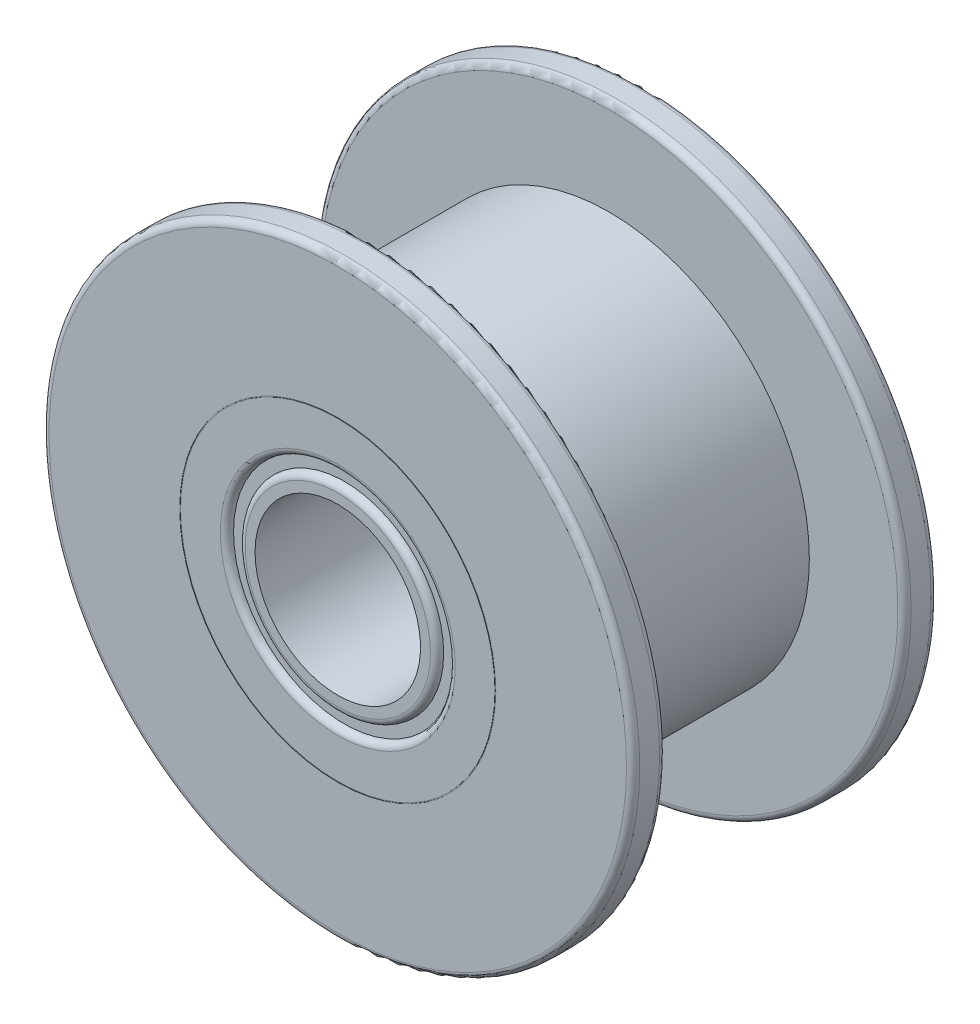
ISO-10303-21;
HEADER;
FILE_DESCRIPTION(('STEP AP214'),'2;1');
FILE_NAME('part.step','',(''),(''),'','','');
FILE_SCHEMA(('AUTOMOTIVE_DESIGN { 1 0 10303 214 1 1 1 1 }'));
ENDSEC;
DATA;
#1=APPLICATION_CONTEXT('core data for automotive mechanical design processes');
#2=APPLICATION_PROTOCOL_DEFINITION('international standard','automotive_design',2000,#1);
#3=PRODUCT_CONTEXT('',#1,'mechanical');
#4=PRODUCT('Part','Part','',(#3));
#5=PRODUCT_RELATED_PRODUCT_CATEGORY('part','',(#4));
#6=PRODUCT_DEFINITION_FORMATION('','',#4);
#7=PRODUCT_DEFINITION_CONTEXT('part definition',#1,'design');
#8=PRODUCT_DEFINITION('design','',#6,#7);
#9=PRODUCT_DEFINITION_SHAPE('','',#8);
#10=(LENGTH_UNIT() NAMED_UNIT(*) SI_UNIT(.MILLI.,.METRE.));
#11=(NAMED_UNIT(*) PLANE_ANGLE_UNIT() SI_UNIT($,.RADIAN.));
#12=(NAMED_UNIT(*) SI_UNIT($,.STERADIAN.) SOLID_ANGLE_UNIT());
#13=UNCERTAINTY_MEASURE_WITH_UNIT(LENGTH_MEASURE(1.E-05),#10,'distance_accuracy_value','');
#14=(GEOMETRIC_REPRESENTATION_CONTEXT(3) GLOBAL_UNCERTAINTY_ASSIGNED_CONTEXT((#13)) GLOBAL_UNIT_ASSIGNED_CONTEXT((#10,
#11,#12)) REPRESENTATION_CONTEXT('',''));
#15=CARTESIAN_POINT('',(0.,0.,0.));
#16=DIRECTION('',(0.,0.,1.));
#17=DIRECTION('',(1.,0.,0.));
#18=AXIS2_PLACEMENT_3D('',#15,#16,#17);
#19=CARTESIAN_POINT('',(0.,0.,-1.));
#20=DIRECTION('',(0.,0.,-1.));
#21=DIRECTION('',(-1.,0.,0.));
#22=AXIS2_PLACEMENT_3D('',#19,#20,#21);
#23=PLANE('',#22);
#24=CARTESIAN_POINT('',(0.,0.,-1.));
#25=DIRECTION('',(0.,0.,-1.));
#26=DIRECTION('',(-1.,0.,0.));
#27=AXIS2_PLACEMENT_3D('',#24,#25,#26);
#28=CIRCLE('',#27,2.8);
#29=CARTESIAN_POINT('',(-2.8,0.,-1.));
#30=VERTEX_POINT('',#29);
#31=EDGE_CURVE('E80',#30,#30,#28,.T.);
#32=ORIENTED_EDGE('',*,*,#31,.T.);
#33=EDGE_LOOP('',(#32));
#34=FACE_BOUND('',#33,.T.);
#35=CARTESIAN_POINT('',(0.,0.,-1.));
#36=DIRECTION('',(0.,0.,-1.));
#37=DIRECTION('',(-1.,0.,0.));
#38=AXIS2_PLACEMENT_3D('',#35,#36,#37);
#39=CIRCLE('',#38,2.5);
#40=CARTESIAN_POINT('',(-2.5,0.,-1.));
#41=VERTEX_POINT('',#40);
#42=EDGE_CURVE('E84',#41,#41,#39,.T.);
#43=ORIENTED_EDGE('',*,*,#42,.F.);
#44=EDGE_LOOP('',(#43));
#45=FACE_BOUND('',#44,.T.);
#46=ADVANCED_FACE('F39',(#34,#45),#23,.T.);
#47=CARTESIAN_POINT('',(0.,0.,8.2));
#48=DIRECTION('',(0.,0.,1.));
#49=DIRECTION('',(1.,0.,0.));
#50=AXIS2_PLACEMENT_3D('',#47,#48,#49);
#51=PLANE('',#50);
#52=CARTESIAN_POINT('',(0.,0.,8.2));
#53=DIRECTION('',(0.,0.,1.));
#54=DIRECTION('',(1.,0.,0.));
#55=AXIS2_PLACEMENT_3D('',#52,#53,#54);
#56=CIRCLE('',#55,2.8);
#57=CARTESIAN_POINT('',(2.8,0.,8.2));
#58=VERTEX_POINT('',#57);
#59=EDGE_CURVE('E74',#58,#58,#56,.T.);
#60=ORIENTED_EDGE('',*,*,#59,.T.);
#61=EDGE_LOOP('',(#60));
#62=FACE_BOUND('',#61,.T.);
#63=CARTESIAN_POINT('',(0.,0.,8.2));
#64=DIRECTION('',(0.,0.,-1.));
#65=DIRECTION('',(-1.,0.,0.));
#66=AXIS2_PLACEMENT_3D('',#63,#64,#65);
#67=CIRCLE('',#66,2.5);
#68=CARTESIAN_POINT('',(-2.5,0.,8.2));
#69=VERTEX_POINT('',#68);
#70=EDGE_CURVE('E83',#69,#69,#67,.T.);
#71=ORIENTED_EDGE('',*,*,#70,.T.);
#72=EDGE_LOOP('',(#71));
#73=FACE_BOUND('',#72,.T.);
#74=ADVANCED_FACE('F153',(#62,#73),#51,.T.);
#75=CARTESIAN_POINT('',(0.,0.,-1.));
#76=DIRECTION('',(0.,0.,-1.));
#77=DIRECTION('',(-1.,0.,0.));
#78=AXIS2_PLACEMENT_3D('',#75,#76,#77);
#79=CIRCLE('',#78,3.55);
#80=CARTESIAN_POINT('',(-3.55,0.,-1.));
#81=VERTEX_POINT('',#80);
#82=EDGE_CURVE('E77',#81,#81,#79,.F.);
#83=ORIENTED_EDGE('',*,*,#82,.T.);
#84=EDGE_LOOP('',(#83));
#85=FACE_BOUND('',#84,.T.);
#86=CARTESIAN_POINT('',(0.,0.,-1.));
#87=DIRECTION('',(0.,0.,-1.));
#88=DIRECTION('',(-1.,0.,0.));
#89=AXIS2_PLACEMENT_3D('',#86,#87,#88);
#90=CIRCLE('',#89,4.75);
#91=CARTESIAN_POINT('',(-4.75,0.,-1.));
#92=VERTEX_POINT('',#91);
#93=EDGE_CURVE('E108',#92,#92,#90,.T.);
#94=ORIENTED_EDGE('',*,*,#93,.T.);
#95=EDGE_LOOP('',(#94));
#96=FACE_BOUND('',#95,.T.);
#97=ADVANCED_FACE('F159',(#85,#96),#23,.T.);
#98=CARTESIAN_POINT('',(0.,0.,8.2));
#99=DIRECTION('',(0.,0.,1.));
#100=DIRECTION('',(1.,0.,0.));
#101=AXIS2_PLACEMENT_3D('',#98,#99,#100);
#102=CIRCLE('',#101,3.55);
#103=CARTESIAN_POINT('',(3.55,0.,8.2));
#104=VERTEX_POINT('',#103);
#105=EDGE_CURVE('E71',#104,#104,#102,.F.);
#106=ORIENTED_EDGE('',*,*,#105,.T.);
#107=EDGE_LOOP('',(#106));
#108=FACE_BOUND('',#107,.T.);
#109=CARTESIAN_POINT('',(0.,0.,8.2));
#110=DIRECTION('',(0.,0.,1.));
#111=DIRECTION('',(1.,0.,0.));
#112=AXIS2_PLACEMENT_3D('',#109,#110,#111);
#113=CIRCLE('',#112,4.75);
#114=CARTESIAN_POINT('',(4.75,0.,8.2));
#115=VERTEX_POINT('',#114);
#116=EDGE_CURVE('E96',#115,#115,#113,.T.);
#117=ORIENTED_EDGE('',*,*,#116,.T.);
#118=EDGE_LOOP('',(#117));
#119=FACE_BOUND('',#118,.T.);
#120=ADVANCED_FACE('F154',(#108,#119),#51,.T.);
#121=CARTESIAN_POINT('',(0.,0.,8.2));
#122=DIRECTION('',(0.,0.,-1.));
#123=DIRECTION('',(-1.,0.,0.));
#124=AXIS2_PLACEMENT_3D('',#121,#122,#123);
#125=CYLINDRICAL_SURFACE('',#124,8.925);
#126=CARTESIAN_POINT('',(0.,0.,8.));
#127=DIRECTION('',(0.,0.,1.));
#128=DIRECTION('',(1.,0.,0.));
#129=AXIS2_PLACEMENT_3D('',#126,#127,#128);
#130=CIRCLE('',#129,8.925);
#131=CARTESIAN_POINT('',(8.925,0.,8.));
#132=VERTEX_POINT('',#131);
#133=EDGE_CURVE('E62',#132,#132,#130,.F.);
#134=ORIENTED_EDGE('',*,*,#133,.T.);
#135=EDGE_LOOP('',(#134));
#136=FACE_BOUND('',#135,.T.);
#137=CARTESIAN_POINT('',(0.,0.,7.4));
#138=DIRECTION('',(0.,0.,1.));
#139=DIRECTION('',(1.,0.,0.));
#140=AXIS2_PLACEMENT_3D('',#137,#138,#139);
#141=CIRCLE('',#140,8.925);
#142=CARTESIAN_POINT('',(8.925,0.,7.4));
#143=VERTEX_POINT('',#142);
#144=EDGE_CURVE('E65',#143,#143,#141,.T.);
#145=ORIENTED_EDGE('',*,*,#144,.T.);
#146=EDGE_LOOP('',(#145));
#147=FACE_BOUND('',#146,.T.);
#148=ADVANCED_FACE('F150',(#136,#147),#125,.T.);
#149=CARTESIAN_POINT('',(0.,0.,8.2));
#150=DIRECTION('',(0.,0.,1.));
#151=DIRECTION('',(1.,0.,0.));
#152=AXIS2_PLACEMENT_3D('',#149,#150,#151);
#153=CIRCLE('',#152,8.725);
#154=CARTESIAN_POINT('',(8.725,0.,8.2));
#155=VERTEX_POINT('',#154);
#156=EDGE_CURVE('E68',#155,#155,#153,.T.);
#157=ORIENTED_EDGE('',*,*,#156,.T.);
#158=EDGE_LOOP('',(#157));
#159=FACE_BOUND('',#158,.T.);
#160=CARTESIAN_POINT('',(0.,0.,8.2));
#161=DIRECTION('',(0.,0.,1.));
#162=DIRECTION('',(1.,0.,0.));
#163=AXIS2_PLACEMENT_3D('',#160,#161,#162);
#164=CIRCLE('',#163,4.775);
#165=CARTESIAN_POINT('',(4.775,0.,8.2));
#166=VERTEX_POINT('',#165);
#167=EDGE_CURVE('E90',#166,#166,#164,.T.);
#168=ORIENTED_EDGE('',*,*,#167,.F.);
#169=EDGE_LOOP('',(#168));
#170=FACE_BOUND('',#169,.T.);
#171=ADVANCED_FACE('F138',(#159,#170),#51,.T.);
#172=CARTESIAN_POINT('',(0.,0.,7.2));
#173=DIRECTION('',(0.,0.,1.));
#174=DIRECTION('',(1.,0.,0.));
#175=AXIS2_PLACEMENT_3D('',#172,#173,#174);
#176=PLANE('',#175);
#177=CARTESIAN_POINT('',(0.,0.,7.2));
#178=DIRECTION('',(0.,0.,1.));
#179=DIRECTION('',(1.,0.,0.));
#180=AXIS2_PLACEMENT_3D('',#177,#178,#179);
#181=CIRCLE('',#180,8.725);
#182=CARTESIAN_POINT('',(8.725,0.,7.2));
#183=VERTEX_POINT('',#182);
#184=EDGE_CURVE('E59',#183,#183,#181,.F.);
#185=ORIENTED_EDGE('',*,*,#184,.T.);
#186=EDGE_LOOP('',(#185));
#187=FACE_BOUND('',#186,.T.);
#188=CARTESIAN_POINT('',(0.,0.,7.2));
#189=DIRECTION('',(0.,0.,-1.));
#190=DIRECTION('',(-1.,0.,0.));
#191=AXIS2_PLACEMENT_3D('',#188,#189,#190);
#192=CIRCLE('',#191,6.05);
#193=CARTESIAN_POINT('',(-6.05,0.,7.2));
#194=VERTEX_POINT('',#193);
#195=EDGE_CURVE('E125',#194,#194,#192,.T.);
#196=ORIENTED_EDGE('',*,*,#195,.F.);
#197=EDGE_LOOP('',(#196));
#198=FACE_BOUND('',#197,.T.);
#199=ADVANCED_FACE('F135',(#187,#198),#176,.F.);
#200=CARTESIAN_POINT('',(0.,0.,-1.));
#201=DIRECTION('',(0.,0.,1.));
#202=DIRECTION('',(1.,0.,0.));
#203=AXIS2_PLACEMENT_3D('',#200,#201,#202);
#204=CYLINDRICAL_SURFACE('',#203,8.925);
#205=CARTESIAN_POINT('',(0.,0.,-0.2));
#206=DIRECTION('',(0.,0.,-1.));
#207=DIRECTION('',(-1.,0.,0.));
#208=AXIS2_PLACEMENT_3D('',#205,#206,#207);
#209=CIRCLE('',#208,8.925);
#210=CARTESIAN_POINT('',(-8.925,0.,-0.2));
#211=VERTEX_POINT('',#210);
#212=EDGE_CURVE('E50',#211,#211,#209,.T.);
#213=ORIENTED_EDGE('',*,*,#212,.T.);
#214=EDGE_LOOP('',(#213));
#215=FACE_BOUND('',#214,.T.);
#216=CARTESIAN_POINT('',(0.,0.,-0.8));
#217=DIRECTION('',(0.,0.,-1.));
#218=DIRECTION('',(-1.,0.,0.));
#219=AXIS2_PLACEMENT_3D('',#216,#217,#218);
#220=CIRCLE('',#219,8.925);
#221=CARTESIAN_POINT('',(-8.925,0.,-0.8));
#222=VERTEX_POINT('',#221);
#223=EDGE_CURVE('E54',#222,#222,#220,.F.);
#224=ORIENTED_EDGE('',*,*,#223,.T.);
#225=EDGE_LOOP('',(#224));
#226=FACE_BOUND('',#225,.T.);
#227=ADVANCED_FACE('F137',(#215,#226),#204,.T.);
#228=CARTESIAN_POINT('',(0.,0.,-1.));
#229=DIRECTION('',(0.,0.,-1.));
#230=DIRECTION('',(-1.,0.,0.));
#231=AXIS2_PLACEMENT_3D('',#228,#229,#230);
#232=CIRCLE('',#231,8.725);
#233=CARTESIAN_POINT('',(-8.725,0.,-1.));
#234=VERTEX_POINT('',#233);
#235=EDGE_CURVE('E11',#234,#234,#232,.T.);
#236=ORIENTED_EDGE('',*,*,#235,.T.);
#237=EDGE_LOOP('',(#236));
#238=FACE_BOUND('',#237,.T.);
#239=CARTESIAN_POINT('',(0.,0.,-1.));
#240=DIRECTION('',(0.,0.,-1.));
#241=DIRECTION('',(-1.,0.,0.));
#242=AXIS2_PLACEMENT_3D('',#239,#240,#241);
#243=CIRCLE('',#242,4.775);
#244=CARTESIAN_POINT('',(-4.775,0.,-1.));
#245=VERTEX_POINT('',#244);
#246=EDGE_CURVE('E102',#245,#245,#243,.T.);
#247=ORIENTED_EDGE('',*,*,#246,.F.);
#248=EDGE_LOOP('',(#247));
#249=FACE_BOUND('',#248,.T.);
#250=ADVANCED_FACE('F146',(#238,#249),#23,.T.);
#251=CARTESIAN_POINT('',(0.,0.,0.));
#252=DIRECTION('',(0.,0.,-1.));
#253=DIRECTION('',(-1.,0.,0.));
#254=AXIS2_PLACEMENT_3D('',#251,#252,#253);
#255=PLANE('',#254);
#256=CARTESIAN_POINT('',(0.,0.,0.));
#257=DIRECTION('',(0.,0.,-1.));
#258=DIRECTION('',(-1.,0.,0.));
#259=AXIS2_PLACEMENT_3D('',#256,#257,#258);
#260=CIRCLE('',#259,8.725);
#261=CARTESIAN_POINT('',(-8.725,0.,0.));
#262=VERTEX_POINT('',#261);
#263=EDGE_CURVE('E46',#262,#262,#260,.F.);
#264=ORIENTED_EDGE('',*,*,#263,.T.);
#265=EDGE_LOOP('',(#264));
#266=FACE_BOUND('',#265,.T.);
#267=CARTESIAN_POINT('',(0.,0.,0.));
#268=DIRECTION('',(0.,0.,-1.));
#269=DIRECTION('',(-1.,0.,0.));
#270=AXIS2_PLACEMENT_3D('',#267,#268,#269);
#271=CIRCLE('',#270,6.05);
#272=CARTESIAN_POINT('',(-6.05,0.,0.));
#273=VERTEX_POINT('',#272);
#274=EDGE_CURVE('E126',#273,#273,#271,.T.);
#275=ORIENTED_EDGE('',*,*,#274,.T.);
#276=EDGE_LOOP('',(#275));
#277=FACE_BOUND('',#276,.T.);
#278=ADVANCED_FACE('F170',(#266,#277),#255,.F.);
#279=CARTESIAN_POINT('',(0.,0.,8.2));
#280=DIRECTION('',(0.,0.,-1.));
#281=DIRECTION('',(-1.,0.,0.));
#282=AXIS2_PLACEMENT_3D('',#279,#280,#281);
#283=CYLINDRICAL_SURFACE('',#282,2.5);
#284=ORIENTED_EDGE('',*,*,#70,.F.);
#285=EDGE_LOOP('',(#284));
#286=FACE_BOUND('',#285,.T.);
#287=ORIENTED_EDGE('',*,*,#42,.T.);
#288=EDGE_LOOP('',(#287));
#289=FACE_BOUND('',#288,.T.);
#290=ADVANCED_FACE('F174',(#286,#289),#283,.F.);
#291=CARTESIAN_POINT('',(0.,0.,8.19));
#292=DIRECTION('',(0.,0.,1.));
#293=DIRECTION('',(1.,0.,0.));
#294=AXIS2_PLACEMENT_3D('',#291,#292,#293);
#295=CYLINDRICAL_SURFACE('',#294,4.775);
#296=CARTESIAN_POINT('',(0.,0.,8.19));
#297=DIRECTION('',(0.,0.,1.));
#298=DIRECTION('',(1.,0.,0.));
#299=AXIS2_PLACEMENT_3D('',#296,#297,#298);
#300=CIRCLE('',#299,4.775);
#301=CARTESIAN_POINT('',(4.775,0.,8.19));
#302=VERTEX_POINT('',#301);
#303=EDGE_CURVE('E87',#302,#302,#300,.T.);
#304=CARTESIAN_POINT('',(4.775,0.,8.19));
#305=CARTESIAN_POINT('',(4.775,0.,8.19010416666666));
#306=CARTESIAN_POINT('',(4.775,0.,8.19020833333333));
#307=CARTESIAN_POINT('',(4.775,0.,8.19041666666667));
#308=CARTESIAN_POINT('',(4.775,0.,8.19052083333333));
#309=CARTESIAN_POINT('',(4.775,0.,8.19072916666667));
#310=CARTESIAN_POINT('',(4.775,0.,8.19083333333333));
#311=CARTESIAN_POINT('',(4.775,0.,8.19104166666667));
#312=CARTESIAN_POINT('',(4.775,0.,8.19114583333333));
#313=CARTESIAN_POINT('',(4.775,0.,8.19135416666667));
#314=CARTESIAN_POINT('',(4.775,0.,8.19145833333333));
#315=CARTESIAN_POINT('',(4.775,0.,8.19166666666666));
#316=CARTESIAN_POINT('',(4.775,0.,8.19177083333333));
#317=CARTESIAN_POINT('',(4.775,0.,8.19197916666666));
#318=CARTESIAN_POINT('',(4.775,0.,8.19208333333333));
#319=CARTESIAN_POINT('',(4.775,0.,8.19229166666667));
#320=CARTESIAN_POINT('',(4.775,0.,8.19239583333333));
#321=CARTESIAN_POINT('',(4.775,0.,8.19260416666667));
#322=CARTESIAN_POINT('',(4.775,0.,8.19270833333333));
#323=CARTESIAN_POINT('',(4.775,0.,8.19291666666667));
#324=CARTESIAN_POINT('',(4.775,0.,8.19302083333333));
#325=CARTESIAN_POINT('',(4.775,0.,8.19322916666667));
#326=CARTESIAN_POINT('',(4.775,0.,8.19333333333333));
#327=CARTESIAN_POINT('',(4.775,0.,8.19354166666666));
#328=CARTESIAN_POINT('',(4.775,0.,8.19364583333333));
#329=CARTESIAN_POINT('',(4.775,0.,8.19385416666666));
#330=CARTESIAN_POINT('',(4.775,0.,8.19395833333333));
#331=CARTESIAN_POINT('',(4.775,0.,8.19416666666667));
#332=CARTESIAN_POINT('',(4.775,0.,8.19427083333333));
#333=CARTESIAN_POINT('',(4.775,0.,8.19447916666667));
#334=CARTESIAN_POINT('',(4.775,0.,8.19458333333333));
#335=CARTESIAN_POINT('',(4.775,0.,8.19479166666666));
#336=CARTESIAN_POINT('',(4.775,0.,8.19489583333333));
#337=CARTESIAN_POINT('',(4.775,0.,8.19510416666667));
#338=CARTESIAN_POINT('',(4.775,0.,8.19520833333333));
#339=CARTESIAN_POINT('',(4.775,0.,8.19541666666666));
#340=CARTESIAN_POINT('',(4.775,0.,8.19552083333333));
#341=CARTESIAN_POINT('',(4.775,0.,8.19572916666667));
#342=CARTESIAN_POINT('',(4.775,0.,8.19583333333333));
#343=CARTESIAN_POINT('',(4.775,0.,8.19604166666667));
#344=CARTESIAN_POINT('',(4.775,0.,8.19614583333333));
#345=CARTESIAN_POINT('',(4.775,0.,8.19635416666667));
#346=CARTESIAN_POINT('',(4.775,0.,8.19645833333333));
#347=CARTESIAN_POINT('',(4.775,0.,8.19666666666667));
#348=CARTESIAN_POINT('',(4.775,0.,8.19677083333333));
#349=CARTESIAN_POINT('',(4.775,0.,8.19697916666667));
#350=CARTESIAN_POINT('',(4.775,0.,8.19708333333333));
#351=CARTESIAN_POINT('',(4.775,0.,8.19729166666666));
#352=CARTESIAN_POINT('',(4.775,0.,8.19739583333333));
#353=CARTESIAN_POINT('',(4.775,0.,8.19760416666667));
#354=CARTESIAN_POINT('',(4.775,0.,8.19770833333333));
#355=CARTESIAN_POINT('',(4.775,0.,8.19791666666667));
#356=CARTESIAN_POINT('',(4.775,0.,8.19802083333333));
#357=CARTESIAN_POINT('',(4.775,0.,8.19822916666666));
#358=CARTESIAN_POINT('',(4.775,0.,8.19833333333333));
#359=CARTESIAN_POINT('',(4.775,0.,8.19854166666667));
#360=CARTESIAN_POINT('',(4.775,0.,8.19864583333333));
#361=CARTESIAN_POINT('',(4.775,0.,8.19885416666667));
#362=CARTESIAN_POINT('',(4.775,0.,8.19895833333333));
#363=CARTESIAN_POINT('',(4.775,0.,8.19916666666666));
#364=CARTESIAN_POINT('',(4.775,0.,8.19927083333333));
#365=CARTESIAN_POINT('',(4.775,0.,8.19947916666667));
#366=CARTESIAN_POINT('',(4.775,0.,8.19958333333333));
#367=CARTESIAN_POINT('',(4.775,0.,8.19979166666666));
#368=CARTESIAN_POINT('',(4.775,0.,8.19989583333333));
#369=CARTESIAN_POINT('',(4.775,0.,8.2));
#370=B_SPLINE_CURVE_WITH_KNOTS('',3,(#304,#305,#306,#307,#308,#309,#310,#311,#312,#313,#314,
#315,#316,#317,#318,#319,#320,#321,#322,#323,#324,#325,#326,#327,#328,#329,#330,#331,#332,#333,
#334,#335,#336,#337,#338,#339,#340,#341,#342,#343,#344,#345,#346,#347,#348,#349,#350,#351,#352,
#353,#354,#355,#356,#357,#358,#359,#360,#361,#362,#363,#364,#365,#366,#367,#368,#369),
.UNSPECIFIED.,.F.,.F.,(4,2,2,2,2,2,2,2,2,2,2,2,2,2,2,2,2,2,2,2,2,2,2,2,2,2,2,2,2,2,2,2,4),(0.,
0.000312500000000313,0.000625000000000625,0.000937500000000938,0.00125000000000125,
0.00156250000000156,0.00187500000000014,0.00218750000000045,0.00250000000000077,
0.00281250000000108,0.00312500000000139,0.00343749999999997,0.00375000000000028,
0.00406250000000059,0.00437500000000091,0.00468750000000122,0.0049999999999998,
0.00531250000000011,0.00562500000000042,0.00593750000000073,0.00625000000000105,
0.00656250000000136,0.00687499999999994,0.00718750000000025,0.00750000000000056,
0.00781250000000087,0.00812500000000119,0.00843749999999976,0.00875000000000008,
0.00906250000000039,0.0093750000000007,0.00968750000000101,0.00999999999999959),.UNSPECIFIED.);
#371=EDGE_CURVE('BSEAM199',#302,#166,#370,.T.);
#372=ORIENTED_EDGE('',*,*,#303,.F.);
#373=ORIENTED_EDGE('',*,*,#167,.T.);
#374=ORIENTED_EDGE('',*,*,#371,.T.);
#375=ORIENTED_EDGE('',*,*,#371,.F.);
#376=EDGE_LOOP('',(#372,#374,#373,#375));
#377=FACE_BOUND('',#376,.T.);
#378=ADVANCED_FACE('F199',(#377),#295,.F.);
#379=CARTESIAN_POINT('',(0.,0.,8.19));
#380=DIRECTION('',(0.,0.,1.));
#381=DIRECTION('',(1.,0.,0.));
#382=AXIS2_PLACEMENT_3D('',#379,#380,#381);
#383=PLANE('',#382);
#384=CARTESIAN_POINT('',(0.,0.,8.19));
#385=DIRECTION('',(0.,0.,1.));
#386=DIRECTION('',(1.,0.,0.));
#387=AXIS2_PLACEMENT_3D('',#384,#385,#386);
#388=CIRCLE('',#387,4.75);
#389=CARTESIAN_POINT('',(4.75,0.,8.19));
#390=VERTEX_POINT('',#389);
#391=EDGE_CURVE('E93',#390,#390,#388,.T.);
#392=ORIENTED_EDGE('',*,*,#391,.F.);
#393=EDGE_LOOP('',(#392));
#394=FACE_BOUND('',#393,.T.);
#395=ORIENTED_EDGE('',*,*,#303,.T.);
#396=EDGE_LOOP('',(#395));
#397=FACE_BOUND('',#396,.T.);
#398=ADVANCED_FACE('F191',(#394,#397),#383,.T.);
#399=CARTESIAN_POINT('',(0.,0.,8.19));
#400=DIRECTION('',(0.,0.,1.));
#401=DIRECTION('',(1.,0.,0.));
#402=AXIS2_PLACEMENT_3D('',#399,#400,#401);
#403=CYLINDRICAL_SURFACE('',#402,4.75);
#404=CARTESIAN_POINT('',(4.75,0.,8.19));
#405=CARTESIAN_POINT('',(4.75,0.,8.19010416666666));
#406=CARTESIAN_POINT('',(4.75,0.,8.19020833333333));
#407=CARTESIAN_POINT('',(4.75,0.,8.19041666666667));
#408=CARTESIAN_POINT('',(4.75,0.,8.19052083333333));
#409=CARTESIAN_POINT('',(4.75,0.,8.19072916666667));
#410=CARTESIAN_POINT('',(4.75,0.,8.19083333333333));
#411=CARTESIAN_POINT('',(4.75,0.,8.19104166666667));
#412=CARTESIAN_POINT('',(4.75,0.,8.19114583333333));
#413=CARTESIAN_POINT('',(4.75,0.,8.19135416666667));
#414=CARTESIAN_POINT('',(4.75,0.,8.19145833333333));
#415=CARTESIAN_POINT('',(4.75,0.,8.19166666666666));
#416=CARTESIAN_POINT('',(4.75,0.,8.19177083333333));
#417=CARTESIAN_POINT('',(4.75,0.,8.19197916666666));
#418=CARTESIAN_POINT('',(4.75,0.,8.19208333333333));
#419=CARTESIAN_POINT('',(4.75,0.,8.19229166666667));
#420=CARTESIAN_POINT('',(4.75,0.,8.19239583333333));
#421=CARTESIAN_POINT('',(4.75,0.,8.19260416666667));
#422=CARTESIAN_POINT('',(4.75,0.,8.19270833333333));
#423=CARTESIAN_POINT('',(4.75,0.,8.19291666666667));
#424=CARTESIAN_POINT('',(4.75,0.,8.19302083333333));
#425=CARTESIAN_POINT('',(4.75,0.,8.19322916666667));
#426=CARTESIAN_POINT('',(4.75,0.,8.19333333333333));
#427=CARTESIAN_POINT('',(4.75,0.,8.19354166666666));
#428=CARTESIAN_POINT('',(4.75,0.,8.19364583333333));
#429=CARTESIAN_POINT('',(4.75,0.,8.19385416666666));
#430=CARTESIAN_POINT('',(4.75,0.,8.19395833333333));
#431=CARTESIAN_POINT('',(4.75,0.,8.19416666666667));
#432=CARTESIAN_POINT('',(4.75,0.,8.19427083333333));
#433=CARTESIAN_POINT('',(4.75,0.,8.19447916666667));
#434=CARTESIAN_POINT('',(4.75,0.,8.19458333333333));
#435=CARTESIAN_POINT('',(4.75,0.,8.19479166666666));
#436=CARTESIAN_POINT('',(4.75,0.,8.19489583333333));
#437=CARTESIAN_POINT('',(4.75,0.,8.19510416666667));
#438=CARTESIAN_POINT('',(4.75,0.,8.19520833333333));
#439=CARTESIAN_POINT('',(4.75,0.,8.19541666666666));
#440=CARTESIAN_POINT('',(4.75,0.,8.19552083333333));
#441=CARTESIAN_POINT('',(4.75,0.,8.19572916666667));
#442=CARTESIAN_POINT('',(4.75,0.,8.19583333333333));
#443=CARTESIAN_POINT('',(4.75,0.,8.19604166666667));
#444=CARTESIAN_POINT('',(4.75,0.,8.19614583333333));
#445=CARTESIAN_POINT('',(4.75,0.,8.19635416666667));
#446=CARTESIAN_POINT('',(4.75,0.,8.19645833333333));
#447=CARTESIAN_POINT('',(4.75,0.,8.19666666666667));
#448=CARTESIAN_POINT('',(4.75,0.,8.19677083333333));
#449=CARTESIAN_POINT('',(4.75,0.,8.19697916666667));
#450=CARTESIAN_POINT('',(4.75,0.,8.19708333333333));
#451=CARTESIAN_POINT('',(4.75,0.,8.19729166666666));
#452=CARTESIAN_POINT('',(4.75,0.,8.19739583333333));
#453=CARTESIAN_POINT('',(4.75,0.,8.19760416666667));
#454=CARTESIAN_POINT('',(4.75,0.,8.19770833333333));
#455=CARTESIAN_POINT('',(4.75,0.,8.19791666666667));
#456=CARTESIAN_POINT('',(4.75,0.,8.19802083333333));
#457=CARTESIAN_POINT('',(4.75,0.,8.19822916666666));
#458=CARTESIAN_POINT('',(4.75,0.,8.19833333333333));
#459=CARTESIAN_POINT('',(4.75,0.,8.19854166666667));
#460=CARTESIAN_POINT('',(4.75,0.,8.19864583333333));
#461=CARTESIAN_POINT('',(4.75,0.,8.19885416666667));
#462=CARTESIAN_POINT('',(4.75,0.,8.19895833333333));
#463=CARTESIAN_POINT('',(4.75,0.,8.19916666666666));
#464=CARTESIAN_POINT('',(4.75,0.,8.19927083333333));
#465=CARTESIAN_POINT('',(4.75,0.,8.19947916666667));
#466=CARTESIAN_POINT('',(4.75,0.,8.19958333333333));
#467=CARTESIAN_POINT('',(4.75,0.,8.19979166666666));
#468=CARTESIAN_POINT('',(4.75,0.,8.19989583333333));
#469=CARTESIAN_POINT('',(4.75,0.,8.2));
#470=B_SPLINE_CURVE_WITH_KNOTS('',3,(#404,#405,#406,#407,#408,#409,#410,#411,#412,#413,#414,
#415,#416,#417,#418,#419,#420,#421,#422,#423,#424,#425,#426,#427,#428,#429,#430,#431,#432,#433,
#434,#435,#436,#437,#438,#439,#440,#441,#442,#443,#444,#445,#446,#447,#448,#449,#450,#451,#452,
#453,#454,#455,#456,#457,#458,#459,#460,#461,#462,#463,#464,#465,#466,#467,#468,#469),
.UNSPECIFIED.,.F.,.F.,(4,2,2,2,2,2,2,2,2,2,2,2,2,2,2,2,2,2,2,2,2,2,2,2,2,2,2,2,2,2,2,2,4),(0.,
0.000312499999998578,0.00062499999999889,0.000937499999999203,0.00124999999999952,
0.00156249999999983,0.00187499999999841,0.00218749999999872,0.00249999999999903,
0.00281249999999934,0.00312499999999966,0.00343749999999823,0.00374999999999855,
0.00406249999999886,0.00437499999999917,0.00468749999999948,0.00499999999999806,
0.00531249999999837,0.00562499999999869,0.005937499999999,0.00624999999999931,
0.00656249999999962,0.0068749999999982,0.00718749999999851,0.00749999999999883,
0.00781249999999914,0.00812499999999945,0.00843749999999803,0.00874999999999834,
0.00906249999999865,0.00937499999999897,0.00968749999999928,0.00999999999999786),.UNSPECIFIED.);
#471=EDGE_CURVE('BSEAM181',#390,#115,#470,.T.);
#472=ORIENTED_EDGE('',*,*,#391,.T.);
#473=ORIENTED_EDGE('',*,*,#116,.F.);
#474=ORIENTED_EDGE('',*,*,#471,.T.);
#475=ORIENTED_EDGE('',*,*,#471,.F.);
#476=EDGE_LOOP('',(#472,#474,#473,#475));
#477=FACE_BOUND('',#476,.T.);
#478=ADVANCED_FACE('F181',(#477),#403,.T.);
#479=CARTESIAN_POINT('',(0.,0.,-0.99));
#480=DIRECTION('',(0.,0.,-1.));
#481=DIRECTION('',(-1.,0.,0.));
#482=AXIS2_PLACEMENT_3D('',#479,#480,#481);
#483=CYLINDRICAL_SURFACE('',#482,4.775);
#484=CARTESIAN_POINT('',(0.,0.,-0.99));
#485=DIRECTION('',(0.,0.,-1.));
#486=DIRECTION('',(-1.,0.,0.));
#487=AXIS2_PLACEMENT_3D('',#484,#485,#486);
#488=CIRCLE('',#487,4.775);
#489=CARTESIAN_POINT('',(-4.775,0.,-0.99));
#490=VERTEX_POINT('',#489);
#491=EDGE_CURVE('E99',#490,#490,#488,.T.);
#492=CARTESIAN_POINT('',(-4.775,0.,-0.99));
#493=CARTESIAN_POINT('',(-4.775,0.,-0.990104166666667));
#494=CARTESIAN_POINT('',(-4.775,0.,-0.990208333333333));
#495=CARTESIAN_POINT('',(-4.775,0.,-0.990416666666667));
#496=CARTESIAN_POINT('',(-4.775,0.,-0.990520833333333));
#497=CARTESIAN_POINT('',(-4.775,0.,-0.990729166666667));
#498=CARTESIAN_POINT('',(-4.775,0.,-0.990833333333333));
#499=CARTESIAN_POINT('',(-4.775,0.,-0.991041666666667));
#500=CARTESIAN_POINT('',(-4.775,0.,-0.991145833333333));
#501=CARTESIAN_POINT('',(-4.775,0.,-0.991354166666667));
#502=CARTESIAN_POINT('',(-4.775,0.,-0.991458333333333));
#503=CARTESIAN_POINT('',(-4.775,0.,-0.991666666666666));
#504=CARTESIAN_POINT('',(-4.775,0.,-0.991770833333333));
#505=CARTESIAN_POINT('',(-4.775,0.,-0.991979166666667));
#506=CARTESIAN_POINT('',(-4.775,0.,-0.992083333333333));
#507=CARTESIAN_POINT('',(-4.775,0.,-0.992291666666666));
#508=CARTESIAN_POINT('',(-4.775,0.,-0.992395833333333));
#509=CARTESIAN_POINT('',(-4.775,0.,-0.992604166666667));
#510=CARTESIAN_POINT('',(-4.775,0.,-0.992708333333333));
#511=CARTESIAN_POINT('',(-4.775,0.,-0.992916666666667));
#512=CARTESIAN_POINT('',(-4.775,0.,-0.993020833333333));
#513=CARTESIAN_POINT('',(-4.775,0.,-0.993229166666667));
#514=CARTESIAN_POINT('',(-4.775,0.,-0.993333333333333));
#515=CARTESIAN_POINT('',(-4.775,0.,-0.993541666666667));
#516=CARTESIAN_POINT('',(-4.775,0.,-0.993645833333333));
#517=CARTESIAN_POINT('',(-4.775,0.,-0.993854166666667));
#518=CARTESIAN_POINT('',(-4.775,0.,-0.993958333333333));
#519=CARTESIAN_POINT('',(-4.775,0.,-0.994166666666667));
#520=CARTESIAN_POINT('',(-4.775,0.,-0.994270833333333));
#521=CARTESIAN_POINT('',(-4.775,0.,-0.994479166666666));
#522=CARTESIAN_POINT('',(-4.775,0.,-0.994583333333333));
#523=CARTESIAN_POINT('',(-4.775,0.,-0.994791666666667));
#524=CARTESIAN_POINT('',(-4.775,0.,-0.994895833333333));
#525=CARTESIAN_POINT('',(-4.775,0.,-0.995104166666666));
#526=CARTESIAN_POINT('',(-4.775,0.,-0.995208333333333));
#527=CARTESIAN_POINT('',(-4.775,0.,-0.995416666666667));
#528=CARTESIAN_POINT('',(-4.775,0.,-0.995520833333333));
#529=CARTESIAN_POINT('',(-4.775,0.,-0.995729166666667));
#530=CARTESIAN_POINT('',(-4.775,0.,-0.995833333333333));
#531=CARTESIAN_POINT('',(-4.775,0.,-0.996041666666667));
#532=CARTESIAN_POINT('',(-4.775,0.,-0.996145833333333));
#533=CARTESIAN_POINT('',(-4.775,0.,-0.996354166666667));
#534=CARTESIAN_POINT('',(-4.775,0.,-0.996458333333333));
#535=CARTESIAN_POINT('',(-4.775,0.,-0.996666666666667));
#536=CARTESIAN_POINT('',(-4.775,0.,-0.996770833333333));
#537=CARTESIAN_POINT('',(-4.775,0.,-0.996979166666667));
#538=CARTESIAN_POINT('',(-4.775,0.,-0.997083333333333));
#539=CARTESIAN_POINT('',(-4.775,0.,-0.997291666666666));
#540=CARTESIAN_POINT('',(-4.775,0.,-0.997395833333333));
#541=CARTESIAN_POINT('',(-4.775,0.,-0.997604166666667));
#542=CARTESIAN_POINT('',(-4.775,0.,-0.997708333333333));
#543=CARTESIAN_POINT('',(-4.775,0.,-0.997916666666667));
#544=CARTESIAN_POINT('',(-4.775,0.,-0.998020833333333));
#545=CARTESIAN_POINT('',(-4.775,0.,-0.998229166666667));
#546=CARTESIAN_POINT('',(-4.775,0.,-0.998333333333333));
#547=CARTESIAN_POINT('',(-4.775,0.,-0.998541666666667));
#548=CARTESIAN_POINT('',(-4.775,0.,-0.998645833333333));
#549=CARTESIAN_POINT('',(-4.775,0.,-0.998854166666667));
#550=CARTESIAN_POINT('',(-4.775,0.,-0.998958333333333));
#551=CARTESIAN_POINT('',(-4.775,0.,-0.999166666666667));
#552=CARTESIAN_POINT('',(-4.775,0.,-0.999270833333333));
#553=CARTESIAN_POINT('',(-4.775,0.,-0.999479166666666));
#554=CARTESIAN_POINT('',(-4.775,0.,-0.999583333333333));
#555=CARTESIAN_POINT('',(-4.775,0.,-0.999791666666667));
#556=CARTESIAN_POINT('',(-4.775,0.,-0.999895833333333));
#557=CARTESIAN_POINT('',(-4.775,0.,-1.));
#558=B_SPLINE_CURVE_WITH_KNOTS('',3,(#492,#493,#494,#495,#496,#497,#498,#499,#500,#501,#502,
#503,#504,#505,#506,#507,#508,#509,#510,#511,#512,#513,#514,#515,#516,#517,#518,#519,#520,#521,
#522,#523,#524,#525,#526,#527,#528,#529,#530,#531,#532,#533,#534,#535,#536,#537,#538,#539,#540,
#541,#542,#543,#544,#545,#546,#547,#548,#549,#550,#551,#552,#553,#554,#555,#556,#557),
.UNSPECIFIED.,.F.,.F.,(4,2,2,2,2,2,2,2,2,2,2,2,2,2,2,2,2,2,2,2,2,2,2,2,2,2,2,2,2,2,2,2,4),(0.,
0.000312499999999879,0.000624999999999975,0.000937499999999853,0.00124999999999995,
0.00156249999999983,0.00187499999999992,0.0021874999999998,0.0024999999999999,
0.00281249999999999,0.00312499999999987,0.00343749999999997,0.00374999999999985,
0.00406249999999994,0.00437499999999982,0.00468749999999992,0.0049999999999998,
0.00531249999999989,0.00562499999999999,0.00593749999999987,0.00624999999999996,
0.00656249999999984,0.00687499999999994,0.00718749999999982,0.00749999999999991,
0.00781250000000001,0.00812499999999989,0.00843749999999998,0.00874999999999986,
0.00906249999999996,0.00937499999999983,0.00968749999999993,0.00999999999999981),.UNSPECIFIED.);
#559=EDGE_CURVE('BSEAM178',#490,#245,#558,.T.);
#560=ORIENTED_EDGE('',*,*,#491,.F.);
#561=ORIENTED_EDGE('',*,*,#246,.T.);
#562=ORIENTED_EDGE('',*,*,#559,.T.);
#563=ORIENTED_EDGE('',*,*,#559,.F.);
#564=EDGE_LOOP('',(#560,#562,#561,#563));
#565=FACE_BOUND('',#564,.T.);
#566=ADVANCED_FACE('F178',(#565),#483,.F.);
#567=CARTESIAN_POINT('',(0.,0.,-0.99));
#568=DIRECTION('',(0.,0.,-1.));
#569=DIRECTION('',(-1.,0.,0.));
#570=AXIS2_PLACEMENT_3D('',#567,#568,#569);
#571=PLANE('',#570);
#572=CARTESIAN_POINT('',(0.,0.,-0.99));
#573=DIRECTION('',(0.,0.,-1.));
#574=DIRECTION('',(-1.,0.,0.));
#575=AXIS2_PLACEMENT_3D('',#572,#573,#574);
#576=CIRCLE('',#575,4.75);
#577=CARTESIAN_POINT('',(-4.75,0.,-0.99));
#578=VERTEX_POINT('',#577);
#579=EDGE_CURVE('E105',#578,#578,#576,.T.);
#580=ORIENTED_EDGE('',*,*,#579,.F.);
#581=EDGE_LOOP('',(#580));
#582=FACE_BOUND('',#581,.T.);
#583=ORIENTED_EDGE('',*,*,#491,.T.);
#584=EDGE_LOOP('',(#583));
#585=FACE_BOUND('',#584,.T.);
#586=ADVANCED_FACE('F180',(#582,#585),#571,.T.);
#587=CARTESIAN_POINT('',(0.,0.,-0.99));
#588=DIRECTION('',(0.,0.,-1.));
#589=DIRECTION('',(-1.,0.,0.));
#590=AXIS2_PLACEMENT_3D('',#587,#588,#589);
#591=CYLINDRICAL_SURFACE('',#590,4.75);
#592=CARTESIAN_POINT('',(-4.75,0.,-0.99));
#593=CARTESIAN_POINT('',(-4.75,0.,-0.990104166666666));
#594=CARTESIAN_POINT('',(-4.75,0.,-0.990208333333333));
#595=CARTESIAN_POINT('',(-4.75,0.,-0.990416666666667));
#596=CARTESIAN_POINT('',(-4.75,0.,-0.990520833333333));
#597=CARTESIAN_POINT('',(-4.75,0.,-0.990729166666667));
#598=CARTESIAN_POINT('',(-4.75,0.,-0.990833333333333));
#599=CARTESIAN_POINT('',(-4.75,0.,-0.991041666666667));
#600=CARTESIAN_POINT('',(-4.75,0.,-0.991145833333333));
#601=CARTESIAN_POINT('',(-4.75,0.,-0.991354166666667));
#602=CARTESIAN_POINT('',(-4.75,0.,-0.991458333333333));
#603=CARTESIAN_POINT('',(-4.75,0.,-0.991666666666666));
#604=CARTESIAN_POINT('',(-4.75,0.,-0.991770833333333));
#605=CARTESIAN_POINT('',(-4.75,0.,-0.991979166666667));
#606=CARTESIAN_POINT('',(-4.75,0.,-0.992083333333333));
#607=CARTESIAN_POINT('',(-4.75,0.,-0.992291666666666));
#608=CARTESIAN_POINT('',(-4.75,0.,-0.992395833333333));
#609=CARTESIAN_POINT('',(-4.75,0.,-0.992604166666667));
#610=CARTESIAN_POINT('',(-4.75,0.,-0.992708333333333));
#611=CARTESIAN_POINT('',(-4.75,0.,-0.992916666666667));
#612=CARTESIAN_POINT('',(-4.75,0.,-0.993020833333333));
#613=CARTESIAN_POINT('',(-4.75,0.,-0.993229166666667));
#614=CARTESIAN_POINT('',(-4.75,0.,-0.993333333333333));
#615=CARTESIAN_POINT('',(-4.75,0.,-0.993541666666667));
#616=CARTESIAN_POINT('',(-4.75,0.,-0.993645833333333));
#617=CARTESIAN_POINT('',(-4.75,0.,-0.993854166666667));
#618=CARTESIAN_POINT('',(-4.75,0.,-0.993958333333333));
#619=CARTESIAN_POINT('',(-4.75,0.,-0.994166666666667));
#620=CARTESIAN_POINT('',(-4.75,0.,-0.994270833333333));
#621=CARTESIAN_POINT('',(-4.75,0.,-0.994479166666666));
#622=CARTESIAN_POINT('',(-4.75,0.,-0.994583333333333));
#623=CARTESIAN_POINT('',(-4.75,0.,-0.994791666666667));
#624=CARTESIAN_POINT('',(-4.75,0.,-0.994895833333333));
#625=CARTESIAN_POINT('',(-4.75,0.,-0.995104166666666));
#626=CARTESIAN_POINT('',(-4.75,0.,-0.995208333333333));
#627=CARTESIAN_POINT('',(-4.75,0.,-0.995416666666667));
#628=CARTESIAN_POINT('',(-4.75,0.,-0.995520833333333));
#629=CARTESIAN_POINT('',(-4.75,0.,-0.995729166666667));
#630=CARTESIAN_POINT('',(-4.75,0.,-0.995833333333333));
#631=CARTESIAN_POINT('',(-4.75,0.,-0.996041666666667));
#632=CARTESIAN_POINT('',(-4.75,0.,-0.996145833333333));
#633=CARTESIAN_POINT('',(-4.75,0.,-0.996354166666667));
#634=CARTESIAN_POINT('',(-4.75,0.,-0.996458333333333));
#635=CARTESIAN_POINT('',(-4.75,0.,-0.996666666666667));
#636=CARTESIAN_POINT('',(-4.75,0.,-0.996770833333333));
#637=CARTESIAN_POINT('',(-4.75,0.,-0.996979166666667));
#638=CARTESIAN_POINT('',(-4.75,0.,-0.997083333333333));
#639=CARTESIAN_POINT('',(-4.75,0.,-0.997291666666666));
#640=CARTESIAN_POINT('',(-4.75,0.,-0.997395833333333));
#641=CARTESIAN_POINT('',(-4.75,0.,-0.997604166666667));
#642=CARTESIAN_POINT('',(-4.75,0.,-0.997708333333333));
#643=CARTESIAN_POINT('',(-4.75,0.,-0.997916666666667));
#644=CARTESIAN_POINT('',(-4.75,0.,-0.998020833333333));
#645=CARTESIAN_POINT('',(-4.75,0.,-0.998229166666667));
#646=CARTESIAN_POINT('',(-4.75,0.,-0.998333333333333));
#647=CARTESIAN_POINT('',(-4.75,0.,-0.998541666666667));
#648=CARTESIAN_POINT('',(-4.75,0.,-0.998645833333333));
#649=CARTESIAN_POINT('',(-4.75,0.,-0.998854166666667));
#650=CARTESIAN_POINT('',(-4.75,0.,-0.998958333333333));
#651=CARTESIAN_POINT('',(-4.75,0.,-0.999166666666667));
#652=CARTESIAN_POINT('',(-4.75,0.,-0.999270833333333));
#653=CARTESIAN_POINT('',(-4.75,0.,-0.999479166666666));
#654=CARTESIAN_POINT('',(-4.75,0.,-0.999583333333333));
#655=CARTESIAN_POINT('',(-4.75,0.,-0.999791666666667));
#656=CARTESIAN_POINT('',(-4.75,0.,-0.999895833333333));
#657=CARTESIAN_POINT('',(-4.75,0.,-1.));
#658=B_SPLINE_CURVE_WITH_KNOTS('',3,(#592,#593,#594,#595,#596,#597,#598,#599,#600,#601,#602,
#603,#604,#605,#606,#607,#608,#609,#610,#611,#612,#613,#614,#615,#616,#617,#618,#619,#620,#621,
#622,#623,#624,#625,#626,#627,#628,#629,#630,#631,#632,#633,#634,#635,#636,#637,#638,#639,#640,
#641,#642,#643,#644,#645,#646,#647,#648,#649,#650,#651,#652,#653,#654,#655,#656,#657),
.UNSPECIFIED.,.F.,.F.,(4,2,2,2,2,2,2,2,2,2,2,2,2,2,2,2,2,2,2,2,2,2,2,2,2,2,2,2,2,2,2,2,4),(0.,
0.000312500000000096,0.000625000000000191,0.00093750000000007,0.00125000000000017,
0.00156250000000004,0.00187500000000014,0.00218750000000002,0.00250000000000011,
0.00281250000000021,0.00312500000000009,0.00343750000000019,0.00375000000000006,
0.00406250000000016,0.00437500000000004,0.00468750000000013,0.00500000000000001,
0.00531250000000011,0.0056250000000002,0.00593750000000008,0.00625000000000018,
0.00656250000000006,0.00687500000000015,0.00718750000000003,0.00750000000000013,
0.00781250000000022,0.0081250000000001,0.0084375000000002,0.00875000000000008,
0.00906250000000017,0.00937500000000005,0.00968750000000015,0.01),.UNSPECIFIED.);
#659=EDGE_CURVE('BSEAM188',#578,#92,#658,.T.);
#660=ORIENTED_EDGE('',*,*,#579,.T.);
#661=ORIENTED_EDGE('',*,*,#93,.F.);
#662=ORIENTED_EDGE('',*,*,#659,.T.);
#663=ORIENTED_EDGE('',*,*,#659,.F.);
#664=EDGE_LOOP('',(#660,#662,#661,#663));
#665=FACE_BOUND('',#664,.T.);
#666=ADVANCED_FACE('F188',(#665),#591,.T.);
#667=CARTESIAN_POINT('',(0.,0.,8.));
#668=DIRECTION('',(0.,0.,1.));
#669=DIRECTION('',(1.,0.,0.));
#670=AXIS2_PLACEMENT_3D('',#667,#668,#669);
#671=PLANE('',#670);
#672=CARTESIAN_POINT('',(0.,0.,8.));
#673=DIRECTION('',(0.,0.,1.));
#674=DIRECTION('',(1.,0.,0.));
#675=AXIS2_PLACEMENT_3D('',#672,#673,#674);
#676=CIRCLE('',#675,3.);
#677=CARTESIAN_POINT('',(3.,0.,8.));
#678=VERTEX_POINT('',#677);
#679=EDGE_CURVE('E116',#678,#678,#676,.T.);
#680=ORIENTED_EDGE('',*,*,#679,.F.);
#681=EDGE_LOOP('',(#680));
#682=FACE_BOUND('',#681,.T.);
#683=CARTESIAN_POINT('',(0.,0.,8.));
#684=DIRECTION('',(0.,0.,1.));
#685=DIRECTION('',(1.,0.,0.));
#686=AXIS2_PLACEMENT_3D('',#683,#684,#685);
#687=CIRCLE('',#686,3.35);
#688=CARTESIAN_POINT('',(3.35,0.,8.));
#689=VERTEX_POINT('',#688);
#690=EDGE_CURVE('E111',#689,#689,#687,.T.);
#691=ORIENTED_EDGE('',*,*,#690,.T.);
#692=EDGE_LOOP('',(#691));
#693=FACE_BOUND('',#692,.T.);
#694=ADVANCED_FACE('F242',(#682,#693),#671,.T.);
#695=CARTESIAN_POINT('',(0.,0.,-0.8));
#696=DIRECTION('',(0.,0.,-1.));
#697=DIRECTION('',(-1.,0.,0.));
#698=AXIS2_PLACEMENT_3D('',#695,#696,#697);
#699=PLANE('',#698);
#700=CARTESIAN_POINT('',(0.,0.,-0.8));
#701=DIRECTION('',(0.,0.,-1.));
#702=DIRECTION('',(-1.,0.,0.));
#703=AXIS2_PLACEMENT_3D('',#700,#701,#702);
#704=CIRCLE('',#703,3.);
#705=CARTESIAN_POINT('',(-3.,0.,-0.8));
#706=VERTEX_POINT('',#705);
#707=EDGE_CURVE('E122',#706,#706,#704,.T.);
#708=ORIENTED_EDGE('',*,*,#707,.F.);
#709=EDGE_LOOP('',(#708));
#710=FACE_BOUND('',#709,.T.);
#711=CARTESIAN_POINT('',(0.,0.,-0.8));
#712=DIRECTION('',(0.,0.,-1.));
#713=DIRECTION('',(-1.,0.,0.));
#714=AXIS2_PLACEMENT_3D('',#711,#712,#713);
#715=CIRCLE('',#714,3.35);
#716=CARTESIAN_POINT('',(-3.35,0.,-0.8));
#717=VERTEX_POINT('',#716);
#718=EDGE_CURVE('E119',#717,#717,#715,.T.);
#719=ORIENTED_EDGE('',*,*,#718,.T.);
#720=EDGE_LOOP('',(#719));
#721=FACE_BOUND('',#720,.T.);
#722=ADVANCED_FACE('F252',(#710,#721),#699,.T.);
#723=CARTESIAN_POINT('',(0.,0.,-0.8));
#724=DIRECTION('',(0.,0.,-1.));
#725=DIRECTION('',(-1.,0.,0.));
#726=AXIS2_PLACEMENT_3D('',#723,#724,#725);
#727=TOROIDAL_SURFACE('',#726,2.8,0.2);
#728=ORIENTED_EDGE('',*,*,#707,.T.);
#729=EDGE_LOOP('',(#728));
#730=FACE_BOUND('',#729,.T.);
#731=ORIENTED_EDGE('',*,*,#31,.F.);
#732=EDGE_LOOP('',(#731));
#733=FACE_BOUND('',#732,.T.);
#734=ADVANCED_FACE('F262',(#730,#733),#727,.T.);
#735=CARTESIAN_POINT('',(0.,0.,-0.8));
#736=DIRECTION('',(0.,0.,-1.));
#737=DIRECTION('',(-1.,0.,0.));
#738=AXIS2_PLACEMENT_3D('',#735,#736,#737);
#739=TOROIDAL_SURFACE('',#738,3.55,0.2);
#740=ORIENTED_EDGE('',*,*,#82,.F.);
#741=EDGE_LOOP('',(#740));
#742=FACE_BOUND('',#741,.T.);
#743=ORIENTED_EDGE('',*,*,#718,.F.);
#744=EDGE_LOOP('',(#743));
#745=FACE_BOUND('',#744,.T.);
#746=ADVANCED_FACE('F295',(#742,#745),#739,.T.);
#747=CARTESIAN_POINT('',(0.,0.,8.));
#748=DIRECTION('',(0.,0.,1.));
#749=DIRECTION('',(1.,0.,0.));
#750=AXIS2_PLACEMENT_3D('',#747,#748,#749);
#751=TOROIDAL_SURFACE('',#750,2.8,0.2);
#752=ORIENTED_EDGE('',*,*,#679,.T.);
#753=EDGE_LOOP('',(#752));
#754=FACE_BOUND('',#753,.T.);
#755=ORIENTED_EDGE('',*,*,#59,.F.);
#756=EDGE_LOOP('',(#755));
#757=FACE_BOUND('',#756,.T.);
#758=ADVANCED_FACE('F305',(#754,#757),#751,.T.);
#759=CARTESIAN_POINT('',(0.,0.,8.));
#760=DIRECTION('',(0.,0.,1.));
#761=DIRECTION('',(1.,0.,0.));
#762=AXIS2_PLACEMENT_3D('',#759,#760,#761);
#763=TOROIDAL_SURFACE('',#762,3.55,0.2);
#764=ORIENTED_EDGE('',*,*,#105,.F.);
#765=EDGE_LOOP('',(#764));
#766=FACE_BOUND('',#765,.T.);
#767=ORIENTED_EDGE('',*,*,#690,.F.);
#768=EDGE_LOOP('',(#767));
#769=FACE_BOUND('',#768,.T.);
#770=ADVANCED_FACE('F315',(#766,#769),#763,.T.);
#771=CARTESIAN_POINT('',(0.,0.,8.));
#772=DIRECTION('',(0.,0.,1.));
#773=DIRECTION('',(1.,0.,0.));
#774=AXIS2_PLACEMENT_3D('',#771,#772,#773);
#775=TOROIDAL_SURFACE('',#774,8.725,0.2);
#776=ORIENTED_EDGE('',*,*,#133,.F.);
#777=EDGE_LOOP('',(#776));
#778=FACE_BOUND('',#777,.T.);
#779=ORIENTED_EDGE('',*,*,#156,.F.);
#780=EDGE_LOOP('',(#779));
#781=FACE_BOUND('',#780,.T.);
#782=ADVANCED_FACE('F325',(#778,#781),#775,.T.);
#783=CARTESIAN_POINT('',(0.,0.,7.4));
#784=DIRECTION('',(0.,0.,1.));
#785=DIRECTION('',(1.,0.,0.));
#786=AXIS2_PLACEMENT_3D('',#783,#784,#785);
#787=TOROIDAL_SURFACE('',#786,8.725,0.2);
#788=ORIENTED_EDGE('',*,*,#184,.F.);
#789=EDGE_LOOP('',(#788));
#790=FACE_BOUND('',#789,.T.);
#791=ORIENTED_EDGE('',*,*,#144,.F.);
#792=EDGE_LOOP('',(#791));
#793=FACE_BOUND('',#792,.T.);
#794=ADVANCED_FACE('F360',(#790,#793),#787,.T.);
#795=CARTESIAN_POINT('',(0.,0.,-0.2));
#796=DIRECTION('',(0.,0.,-1.));
#797=DIRECTION('',(-1.,0.,0.));
#798=AXIS2_PLACEMENT_3D('',#795,#796,#797);
#799=TOROIDAL_SURFACE('',#798,8.725,0.2);
#800=ORIENTED_EDGE('',*,*,#263,.F.);
#801=EDGE_LOOP('',(#800));
#802=FACE_BOUND('',#801,.T.);
#803=ORIENTED_EDGE('',*,*,#212,.F.);
#804=EDGE_LOOP('',(#803));
#805=FACE_BOUND('',#804,.T.);
#806=ADVANCED_FACE('F370',(#802,#805),#799,.T.);
#807=CARTESIAN_POINT('',(0.,0.,-0.8));
#808=DIRECTION('',(0.,0.,-1.));
#809=DIRECTION('',(-1.,0.,0.));
#810=AXIS2_PLACEMENT_3D('',#807,#808,#809);
#811=TOROIDAL_SURFACE('',#810,8.725,0.2);
#812=ORIENTED_EDGE('',*,*,#223,.F.);
#813=EDGE_LOOP('',(#812));
#814=FACE_BOUND('',#813,.T.);
#815=ORIENTED_EDGE('',*,*,#235,.F.);
#816=EDGE_LOOP('',(#815));
#817=FACE_BOUND('',#816,.T.);
#818=ADVANCED_FACE('F41',(#814,#817),#811,.T.);
#819=CARTESIAN_POINT('',(0.,0.,-18.3847763108502));
#820=DIRECTION('',(0.,0.,1.));
#821=DIRECTION('',(1.,0.,0.));
#822=AXIS2_PLACEMENT_3D('',#819,#820,#821);
#823=CYLINDRICAL_SURFACE('',#822,6.05);
#824=ORIENTED_EDGE('',*,*,#195,.T.);
#825=EDGE_LOOP('',(#824));
#826=FACE_BOUND('',#825,.T.);
#827=ORIENTED_EDGE('',*,*,#274,.F.);
#828=EDGE_LOOP('',(#827));
#829=FACE_BOUND('',#828,.T.);
#830=ADVANCED_FACE('F132',(#826,#829),#823,.T.);
#831=CLOSED_SHELL('',(#46,#74,#97,#120,#148,#171,#199,#227,#250,#278,#290,#378,#398,#478,#566,
#586,#666,#694,#722,#734,#746,#758,#770,#782,#794,#806,#818,#830));
#832=MANIFOLD_SOLID_BREP('B2',#831);
#833=ADVANCED_BREP_SHAPE_REPRESENTATION('',(#18,#832),#14);
#834=SHAPE_DEFINITION_REPRESENTATION(#9,#833);
ENDSEC;
END-ISO-10303-21;
